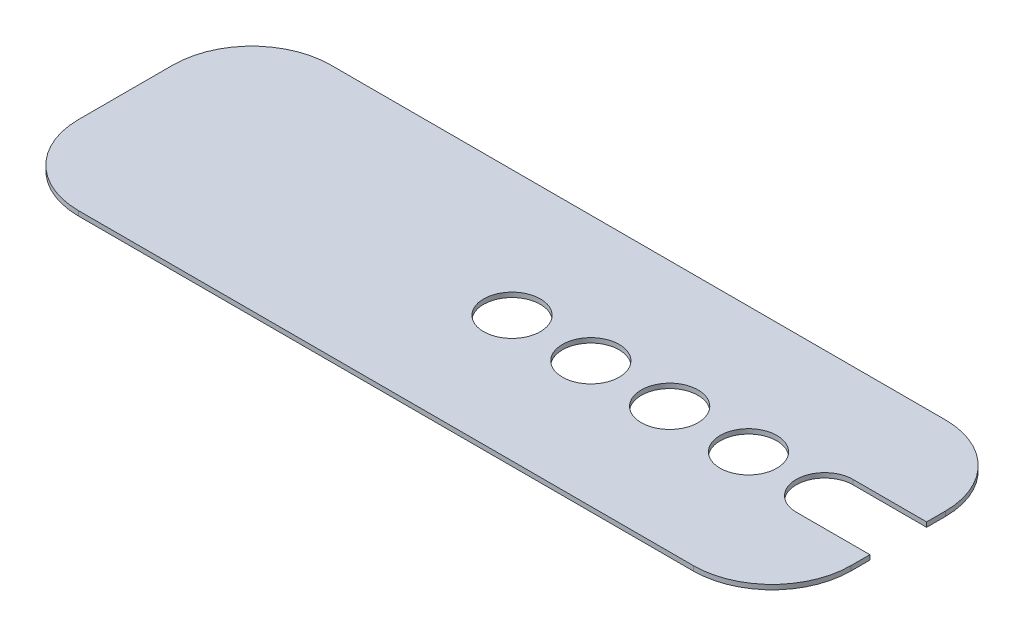
ISO-10303-21;
HEADER;
FILE_DESCRIPTION(('STEP AP214'),'2;1');
FILE_NAME('part.step','',(''),(''),'','','');
FILE_SCHEMA(('AUTOMOTIVE_DESIGN { 1 0 10303 214 1 1 1 1 }'));
ENDSEC;
DATA;
#1=APPLICATION_CONTEXT('core data for automotive mechanical design processes');
#2=APPLICATION_PROTOCOL_DEFINITION('international standard','automotive_design',2000,#1);
#3=PRODUCT_CONTEXT('',#1,'mechanical');
#4=PRODUCT('Part','Part','',(#3));
#5=PRODUCT_RELATED_PRODUCT_CATEGORY('part','',(#4));
#6=PRODUCT_DEFINITION_FORMATION('','',#4);
#7=PRODUCT_DEFINITION_CONTEXT('part definition',#1,'design');
#8=PRODUCT_DEFINITION('design','',#6,#7);
#9=PRODUCT_DEFINITION_SHAPE('','',#8);
#10=(LENGTH_UNIT() NAMED_UNIT(*) SI_UNIT(.MILLI.,.METRE.));
#11=(NAMED_UNIT(*) PLANE_ANGLE_UNIT() SI_UNIT($,.RADIAN.));
#12=(NAMED_UNIT(*) SI_UNIT($,.STERADIAN.) SOLID_ANGLE_UNIT());
#13=UNCERTAINTY_MEASURE_WITH_UNIT(LENGTH_MEASURE(1.E-05),#10,'distance_accuracy_value','');
#14=(GEOMETRIC_REPRESENTATION_CONTEXT(3) GLOBAL_UNCERTAINTY_ASSIGNED_CONTEXT((#13)) GLOBAL_UNIT_ASSIGNED_CONTEXT((#10,
#11,#12)) REPRESENTATION_CONTEXT('',''));
#15=CARTESIAN_POINT('',(0.,0.,0.));
#16=DIRECTION('',(0.,0.,1.));
#17=DIRECTION('',(1.,0.,0.));
#18=AXIS2_PLACEMENT_3D('',#15,#16,#17);
#19=CARTESIAN_POINT('',(122.5,1.5,-14.9999999999998));
#20=DIRECTION('',(-1.,0.,0.));
#21=DIRECTION('',(0.,0.,1.));
#22=AXIS2_PLACEMENT_3D('',#19,#20,#21);
#23=PLANE('',#22);
#24=DIRECTION('',(0.,0.,-1.));
#25=VECTOR('',#24,1.);
#26=CARTESIAN_POINT('',(122.5,1.5,-14.9999999999998));
#27=LINE('',#26,#25);
#28=CARTESIAN_POINT('',(122.5,1.5,-9.));
#29=VERTEX_POINT('',#28);
#30=CARTESIAN_POINT('',(122.5,1.5,-14.9999999999998));
#31=VERTEX_POINT('',#30);
#32=EDGE_CURVE('E60',#29,#31,#27,.T.);
#33=ORIENTED_EDGE('',*,*,#32,.F.);
#34=DIRECTION('',(0.,1.,0.));
#35=VECTOR('',#34,1.);
#36=CARTESIAN_POINT('',(122.5,0.,-9.));
#37=LINE('',#36,#35);
#38=CARTESIAN_POINT('',(122.5,0.,-9.));
#39=VERTEX_POINT('',#38);
#40=EDGE_CURVE('E225',#39,#29,#37,.T.);
#41=ORIENTED_EDGE('',*,*,#40,.F.);
#42=DIRECTION('',(0.,0.,-1.));
#43=VECTOR('',#42,1.);
#44=CARTESIAN_POINT('',(122.5,0.,-14.9999999999998));
#45=LINE('',#44,#43);
#46=CARTESIAN_POINT('',(122.5,0.,-14.9999999999998));
#47=VERTEX_POINT('',#46);
#48=EDGE_CURVE('E94',#39,#47,#45,.T.);
#49=ORIENTED_EDGE('',*,*,#48,.T.);
#50=DIRECTION('',(0.,-1.,0.));
#51=VECTOR('',#50,1.);
#52=CARTESIAN_POINT('',(122.5,1.5,-14.9999999999998));
#53=LINE('',#52,#51);
#54=EDGE_CURVE('E150',#31,#47,#53,.T.);
#55=ORIENTED_EDGE('',*,*,#54,.F.);
#56=EDGE_LOOP('',(#33,#41,#49,#55));
#57=FACE_BOUND('',#56,.T.);
#58=ADVANCED_FACE('F36',(#57),#23,.F.);
#59=CARTESIAN_POINT('',(97.5,1.5,-15.));
#60=DIRECTION('',(0.,-1.,0.));
#61=DIRECTION('',(0.,0.,-1.));
#62=AXIS2_PLACEMENT_3D('',#59,#60,#61);
#63=CYLINDRICAL_SURFACE('',#62,25.);
#64=CARTESIAN_POINT('',(97.5,0.,-15.));
#65=DIRECTION('',(0.,1.,0.));
#66=DIRECTION('',(0.,0.,1.));
#67=AXIS2_PLACEMENT_3D('',#64,#65,#66);
#68=CIRCLE('',#67,25.);
#69=CARTESIAN_POINT('',(97.4999999999998,0.,-40.));
#70=VERTEX_POINT('',#69);
#71=EDGE_CURVE('E151',#47,#70,#68,.T.);
#72=ORIENTED_EDGE('',*,*,#71,.T.);
#73=DIRECTION('',(0.,-1.,0.));
#74=VECTOR('',#73,1.);
#75=CARTESIAN_POINT('',(97.4999999999998,1.5,-40.));
#76=LINE('',#75,#74);
#77=CARTESIAN_POINT('',(97.4999999999998,1.5,-40.));
#78=VERTEX_POINT('',#77);
#79=EDGE_CURVE('E11',#78,#70,#76,.T.);
#80=ORIENTED_EDGE('',*,*,#79,.F.);
#81=CARTESIAN_POINT('',(97.5,1.5,-15.));
#82=DIRECTION('',(0.,1.,0.));
#83=DIRECTION('',(0.,0.,1.));
#84=AXIS2_PLACEMENT_3D('',#81,#82,#83);
#85=CIRCLE('',#84,25.);
#86=EDGE_CURVE('E169',#31,#78,#85,.T.);
#87=ORIENTED_EDGE('',*,*,#86,.F.);
#88=ORIENTED_EDGE('',*,*,#54,.T.);
#89=EDGE_LOOP('',(#72,#80,#87,#88));
#90=FACE_BOUND('',#89,.T.);
#91=ADVANCED_FACE('F38',(#90),#63,.T.);
#92=CARTESIAN_POINT('',(-97.4999999999998,1.5,-40.));
#93=DIRECTION('',(0.,0.,1.));
#94=DIRECTION('',(1.,0.,0.));
#95=AXIS2_PLACEMENT_3D('',#92,#93,#94);
#96=PLANE('',#95);
#97=DIRECTION('',(-1.,0.,0.));
#98=VECTOR('',#97,1.);
#99=CARTESIAN_POINT('',(-97.4999999999998,0.,-40.));
#100=LINE('',#99,#98);
#101=CARTESIAN_POINT('',(-97.4999999999998,0.,-40.));
#102=VERTEX_POINT('',#101);
#103=EDGE_CURVE('E154',#70,#102,#100,.T.);
#104=ORIENTED_EDGE('',*,*,#103,.T.);
#105=DIRECTION('',(0.,-1.,0.));
#106=VECTOR('',#105,1.);
#107=CARTESIAN_POINT('',(-97.4999999999998,1.5,-40.));
#108=LINE('',#107,#106);
#109=CARTESIAN_POINT('',(-97.4999999999998,1.5,-40.));
#110=VERTEX_POINT('',#109);
#111=EDGE_CURVE('E44',#110,#102,#108,.T.);
#112=ORIENTED_EDGE('',*,*,#111,.F.);
#113=DIRECTION('',(-1.,0.,0.));
#114=VECTOR('',#113,1.);
#115=CARTESIAN_POINT('',(-97.4999999999998,1.5,-40.));
#116=LINE('',#115,#114);
#117=EDGE_CURVE('E102',#78,#110,#116,.T.);
#118=ORIENTED_EDGE('',*,*,#117,.F.);
#119=ORIENTED_EDGE('',*,*,#79,.T.);
#120=EDGE_LOOP('',(#104,#112,#118,#119));
#121=FACE_BOUND('',#120,.T.);
#122=ADVANCED_FACE('F282',(#121),#96,.F.);
#123=CARTESIAN_POINT('',(-97.5,1.5,-15.));
#124=DIRECTION('',(0.,-1.,0.));
#125=DIRECTION('',(0.,0.,-1.));
#126=AXIS2_PLACEMENT_3D('',#123,#124,#125);
#127=CYLINDRICAL_SURFACE('',#126,25.);
#128=CARTESIAN_POINT('',(-97.5,0.,-15.));
#129=DIRECTION('',(0.,1.,0.));
#130=DIRECTION('',(0.,0.,1.));
#131=AXIS2_PLACEMENT_3D('',#128,#129,#130);
#132=CIRCLE('',#131,25.);
#133=CARTESIAN_POINT('',(-122.5,0.,-14.9999999999998));
#134=VERTEX_POINT('',#133);
#135=EDGE_CURVE('E157',#102,#134,#132,.T.);
#136=ORIENTED_EDGE('',*,*,#135,.T.);
#137=DIRECTION('',(0.,-1.,0.));
#138=VECTOR('',#137,1.);
#139=CARTESIAN_POINT('',(-122.5,1.5,-14.9999999999998));
#140=LINE('',#139,#138);
#141=CARTESIAN_POINT('',(-122.5,1.5,-14.9999999999998));
#142=VERTEX_POINT('',#141);
#143=EDGE_CURVE('E176',#142,#134,#140,.T.);
#144=ORIENTED_EDGE('',*,*,#143,.F.);
#145=CARTESIAN_POINT('',(-97.5,1.5,-15.));
#146=DIRECTION('',(0.,1.,0.));
#147=DIRECTION('',(0.,0.,1.));
#148=AXIS2_PLACEMENT_3D('',#145,#146,#147);
#149=CIRCLE('',#148,25.);
#150=EDGE_CURVE('E184',#110,#142,#149,.T.);
#151=ORIENTED_EDGE('',*,*,#150,.F.);
#152=ORIENTED_EDGE('',*,*,#111,.T.);
#153=EDGE_LOOP('',(#136,#144,#151,#152));
#154=FACE_BOUND('',#153,.T.);
#155=ADVANCED_FACE('F182',(#154),#127,.T.);
#156=CARTESIAN_POINT('',(-122.5,1.5,-14.9999999999998));
#157=DIRECTION('',(1.,0.,0.));
#158=DIRECTION('',(0.,0.,-1.));
#159=AXIS2_PLACEMENT_3D('',#156,#157,#158);
#160=PLANE('',#159);
#161=DIRECTION('',(0.,0.,1.));
#162=VECTOR('',#161,1.);
#163=CARTESIAN_POINT('',(-122.5,0.,-14.9999999999998));
#164=LINE('',#163,#162);
#165=CARTESIAN_POINT('',(-122.5,0.,14.9999999999998));
#166=VERTEX_POINT('',#165);
#167=EDGE_CURVE('E159',#134,#166,#164,.T.);
#168=ORIENTED_EDGE('',*,*,#167,.T.);
#169=DIRECTION('',(0.,-1.,0.));
#170=VECTOR('',#169,1.);
#171=CARTESIAN_POINT('',(-122.5,1.5,14.9999999999998));
#172=LINE('',#171,#170);
#173=CARTESIAN_POINT('',(-122.5,1.5,14.9999999999998));
#174=VERTEX_POINT('',#173);
#175=EDGE_CURVE('E173',#174,#166,#172,.T.);
#176=ORIENTED_EDGE('',*,*,#175,.F.);
#177=DIRECTION('',(0.,0.,1.));
#178=VECTOR('',#177,1.);
#179=CARTESIAN_POINT('',(-122.5,1.5,-14.9999999999998));
#180=LINE('',#179,#178);
#181=EDGE_CURVE('E196',#142,#174,#180,.T.);
#182=ORIENTED_EDGE('',*,*,#181,.F.);
#183=ORIENTED_EDGE('',*,*,#143,.T.);
#184=EDGE_LOOP('',(#168,#176,#182,#183));
#185=FACE_BOUND('',#184,.T.);
#186=ADVANCED_FACE('F192',(#185),#160,.F.);
#187=CARTESIAN_POINT('',(-97.5,1.5,15.));
#188=DIRECTION('',(0.,-1.,0.));
#189=DIRECTION('',(0.,0.,-1.));
#190=AXIS2_PLACEMENT_3D('',#187,#188,#189);
#191=CYLINDRICAL_SURFACE('',#190,25.);
#192=CARTESIAN_POINT('',(-97.5,0.,15.));
#193=DIRECTION('',(0.,1.,0.));
#194=DIRECTION('',(0.,0.,-1.));
#195=AXIS2_PLACEMENT_3D('',#192,#193,#194);
#196=CIRCLE('',#195,25.);
#197=CARTESIAN_POINT('',(-97.4999999999998,0.,40.));
#198=VERTEX_POINT('',#197);
#199=EDGE_CURVE('E161',#166,#198,#196,.T.);
#200=ORIENTED_EDGE('',*,*,#199,.T.);
#201=DIRECTION('',(0.,-1.,0.));
#202=VECTOR('',#201,1.);
#203=CARTESIAN_POINT('',(-97.4999999999998,1.5,40.));
#204=LINE('',#203,#202);
#205=CARTESIAN_POINT('',(-97.4999999999998,1.5,40.));
#206=VERTEX_POINT('',#205);
#207=EDGE_CURVE('E139',#206,#198,#204,.T.);
#208=ORIENTED_EDGE('',*,*,#207,.F.);
#209=CARTESIAN_POINT('',(-97.5,1.5,15.));
#210=DIRECTION('',(0.,1.,0.));
#211=DIRECTION('',(0.,0.,-1.));
#212=AXIS2_PLACEMENT_3D('',#209,#210,#211);
#213=CIRCLE('',#212,25.);
#214=EDGE_CURVE('E127',#174,#206,#213,.T.);
#215=ORIENTED_EDGE('',*,*,#214,.F.);
#216=ORIENTED_EDGE('',*,*,#175,.T.);
#217=EDGE_LOOP('',(#200,#208,#215,#216));
#218=FACE_BOUND('',#217,.T.);
#219=ADVANCED_FACE('F195',(#218),#191,.T.);
#220=CARTESIAN_POINT('',(-97.4999999999998,1.5,40.));
#221=DIRECTION('',(0.,0.,-1.));
#222=DIRECTION('',(-1.,0.,0.));
#223=AXIS2_PLACEMENT_3D('',#220,#221,#222);
#224=PLANE('',#223);
#225=DIRECTION('',(1.,0.,0.));
#226=VECTOR('',#225,1.);
#227=CARTESIAN_POINT('',(-97.4999999999998,0.,40.));
#228=LINE('',#227,#226);
#229=CARTESIAN_POINT('',(97.4999999999998,0.,40.));
#230=VERTEX_POINT('',#229);
#231=EDGE_CURVE('E136',#198,#230,#228,.T.);
#232=ORIENTED_EDGE('',*,*,#231,.T.);
#233=DIRECTION('',(0.,-1.,0.));
#234=VECTOR('',#233,1.);
#235=CARTESIAN_POINT('',(97.4999999999998,1.5,40.));
#236=LINE('',#235,#234);
#237=CARTESIAN_POINT('',(97.4999999999998,1.5,40.));
#238=VERTEX_POINT('',#237);
#239=EDGE_CURVE('E133',#238,#230,#236,.T.);
#240=ORIENTED_EDGE('',*,*,#239,.F.);
#241=DIRECTION('',(1.,0.,0.));
#242=VECTOR('',#241,1.);
#243=CARTESIAN_POINT('',(-97.4999999999998,1.5,40.));
#244=LINE('',#243,#242);
#245=EDGE_CURVE('E118',#206,#238,#244,.T.);
#246=ORIENTED_EDGE('',*,*,#245,.F.);
#247=ORIENTED_EDGE('',*,*,#207,.T.);
#248=EDGE_LOOP('',(#232,#240,#246,#247));
#249=FACE_BOUND('',#248,.T.);
#250=ADVANCED_FACE('F134',(#249),#224,.F.);
#251=CARTESIAN_POINT('',(97.5,1.5,15.));
#252=DIRECTION('',(0.,-1.,0.));
#253=DIRECTION('',(0.,0.,-1.));
#254=AXIS2_PLACEMENT_3D('',#251,#252,#253);
#255=CYLINDRICAL_SURFACE('',#254,25.);
#256=CARTESIAN_POINT('',(97.5,0.,15.));
#257=DIRECTION('',(0.,1.,0.));
#258=DIRECTION('',(0.,0.,1.));
#259=AXIS2_PLACEMENT_3D('',#256,#257,#258);
#260=CIRCLE('',#259,25.);
#261=CARTESIAN_POINT('',(122.5,0.,14.9999999999998));
#262=VERTEX_POINT('',#261);
#263=EDGE_CURVE('E164',#230,#262,#260,.T.);
#264=ORIENTED_EDGE('',*,*,#263,.T.);
#265=DIRECTION('',(0.,-1.,0.));
#266=VECTOR('',#265,1.);
#267=CARTESIAN_POINT('',(122.5,1.5,14.9999999999998));
#268=LINE('',#267,#266);
#269=CARTESIAN_POINT('',(122.5,1.5,14.9999999999998));
#270=VERTEX_POINT('',#269);
#271=EDGE_CURVE('E140',#270,#262,#268,.T.);
#272=ORIENTED_EDGE('',*,*,#271,.F.);
#273=CARTESIAN_POINT('',(97.5,1.5,15.));
#274=DIRECTION('',(0.,1.,0.));
#275=DIRECTION('',(0.,0.,1.));
#276=AXIS2_PLACEMENT_3D('',#273,#274,#275);
#277=CIRCLE('',#276,25.);
#278=EDGE_CURVE('E124',#238,#270,#277,.T.);
#279=ORIENTED_EDGE('',*,*,#278,.F.);
#280=ORIENTED_EDGE('',*,*,#239,.T.);
#281=EDGE_LOOP('',(#264,#272,#279,#280));
#282=FACE_BOUND('',#281,.T.);
#283=ADVANCED_FACE('F142',(#282),#255,.T.);
#284=CARTESIAN_POINT('',(122.5,0.,9.));
#285=VERTEX_POINT('',#284);
#286=EDGE_CURVE('E166',#262,#285,#45,.T.);
#287=ORIENTED_EDGE('',*,*,#286,.T.);
#288=DIRECTION('',(0.,1.,0.));
#289=VECTOR('',#288,1.);
#290=CARTESIAN_POINT('',(122.5,0.,9.));
#291=LINE('',#290,#289);
#292=CARTESIAN_POINT('',(122.5,1.5,9.));
#293=VERTEX_POINT('',#292);
#294=EDGE_CURVE('E51',#285,#293,#291,.T.);
#295=ORIENTED_EDGE('',*,*,#294,.T.);
#296=EDGE_CURVE('E146',#270,#293,#27,.T.);
#297=ORIENTED_EDGE('',*,*,#296,.F.);
#298=ORIENTED_EDGE('',*,*,#271,.T.);
#299=EDGE_LOOP('',(#287,#295,#297,#298));
#300=FACE_BOUND('',#299,.T.);
#301=ADVANCED_FACE('F263',(#300),#23,.F.);
#302=CARTESIAN_POINT('',(97.5,1.5,-15.));
#303=DIRECTION('',(0.,1.,0.));
#304=DIRECTION('',(0.,0.,1.));
#305=AXIS2_PLACEMENT_3D('',#302,#303,#304);
#306=PLANE('',#305);
#307=CARTESIAN_POINT('',(50.,1.5,0.));
#308=DIRECTION('',(0.,1.,0.));
#309=DIRECTION('',(0.,0.,1.));
#310=AXIS2_PLACEMENT_3D('',#307,#308,#309);
#311=CIRCLE('',#310,9.);
#312=CARTESIAN_POINT('',(50.,1.5,9.));
#313=VERTEX_POINT('',#312);
#314=EDGE_CURVE('E215',#313,#313,#311,.T.);
#315=ORIENTED_EDGE('',*,*,#314,.F.);
#316=EDGE_LOOP('',(#315));
#317=FACE_BOUND('',#316,.T.);
#318=CARTESIAN_POINT('',(25.,1.5,0.));
#319=DIRECTION('',(0.,1.,0.));
#320=DIRECTION('',(0.,0.,1.));
#321=AXIS2_PLACEMENT_3D('',#318,#319,#320);
#322=CIRCLE('',#321,9.);
#323=CARTESIAN_POINT('',(25.,1.5,9.));
#324=VERTEX_POINT('',#323);
#325=EDGE_CURVE('E208',#324,#324,#322,.T.);
#326=ORIENTED_EDGE('',*,*,#325,.F.);
#327=EDGE_LOOP('',(#326));
#328=FACE_BOUND('',#327,.T.);
#329=CARTESIAN_POINT('',(0.,1.5,0.));
#330=DIRECTION('',(0.,1.,0.));
#331=DIRECTION('',(0.,0.,1.));
#332=AXIS2_PLACEMENT_3D('',#329,#330,#331);
#333=CIRCLE('',#332,9.);
#334=CARTESIAN_POINT('',(0.,1.5,9.));
#335=VERTEX_POINT('',#334);
#336=EDGE_CURVE('E231',#335,#335,#333,.T.);
#337=ORIENTED_EDGE('',*,*,#336,.F.);
#338=EDGE_LOOP('',(#337));
#339=FACE_BOUND('',#338,.T.);
#340=DIRECTION('',(-1.,0.,0.));
#341=VECTOR('',#340,1.);
#342=CARTESIAN_POINT('',(99.15,1.5,-9.));
#343=LINE('',#342,#341);
#344=CARTESIAN_POINT('',(99.15,1.5,-9.));
#345=VERTEX_POINT('',#344);
#346=EDGE_CURVE('E232',#29,#345,#343,.T.);
#347=ORIENTED_EDGE('',*,*,#346,.F.);
#348=ORIENTED_EDGE('',*,*,#32,.T.);
#349=ORIENTED_EDGE('',*,*,#86,.T.);
#350=ORIENTED_EDGE('',*,*,#117,.T.);
#351=ORIENTED_EDGE('',*,*,#150,.T.);
#352=ORIENTED_EDGE('',*,*,#181,.T.);
#353=ORIENTED_EDGE('',*,*,#214,.T.);
#354=ORIENTED_EDGE('',*,*,#245,.T.);
#355=ORIENTED_EDGE('',*,*,#278,.T.);
#356=ORIENTED_EDGE('',*,*,#296,.T.);
#357=DIRECTION('',(1.,0.,0.));
#358=VECTOR('',#357,1.);
#359=CARTESIAN_POINT('',(99.15,1.5,9.));
#360=LINE('',#359,#358);
#361=CARTESIAN_POINT('',(99.15,1.5,9.));
#362=VERTEX_POINT('',#361);
#363=EDGE_CURVE('E236',#362,#293,#360,.T.);
#364=ORIENTED_EDGE('',*,*,#363,.F.);
#365=CARTESIAN_POINT('',(99.15,1.5,0.));
#366=DIRECTION('',(0.,1.,0.));
#367=DIRECTION('',(0.,0.,1.));
#368=AXIS2_PLACEMENT_3D('',#365,#366,#367);
#369=CIRCLE('',#368,9.);
#370=EDGE_CURVE('E238',#345,#362,#369,.T.);
#371=ORIENTED_EDGE('',*,*,#370,.F.);
#372=EDGE_LOOP('',(#347,#348,#349,#350,#351,#352,#353,#354,#355,#356,#364,#371));
#373=FACE_BOUND('',#372,.T.);
#374=CARTESIAN_POINT('',(75.,1.5,0.));
#375=DIRECTION('',(0.,1.,0.));
#376=DIRECTION('',(0.,0.,1.));
#377=AXIS2_PLACEMENT_3D('',#374,#375,#376);
#378=CIRCLE('',#377,9.);
#379=CARTESIAN_POINT('',(75.,1.5,9.));
#380=VERTEX_POINT('',#379);
#381=EDGE_CURVE('E202',#380,#380,#378,.T.);
#382=ORIENTED_EDGE('',*,*,#381,.F.);
#383=EDGE_LOOP('',(#382));
#384=FACE_BOUND('',#383,.T.);
#385=ADVANCED_FACE('F120',(#317,#328,#339,#373,#384),#306,.T.);
#386=CARTESIAN_POINT('',(97.5,0.,-15.));
#387=DIRECTION('',(0.,1.,0.));
#388=DIRECTION('',(0.,0.,1.));
#389=AXIS2_PLACEMENT_3D('',#386,#387,#388);
#390=PLANE('',#389);
#391=CARTESIAN_POINT('',(50.,0.,0.));
#392=DIRECTION('',(0.,1.,0.));
#393=DIRECTION('',(0.,0.,1.));
#394=AXIS2_PLACEMENT_3D('',#391,#392,#393);
#395=CIRCLE('',#394,9.);
#396=CARTESIAN_POINT('',(50.,0.,9.));
#397=VERTEX_POINT('',#396);
#398=EDGE_CURVE('E205',#397,#397,#395,.T.);
#399=ORIENTED_EDGE('',*,*,#398,.T.);
#400=EDGE_LOOP('',(#399));
#401=FACE_BOUND('',#400,.T.);
#402=CARTESIAN_POINT('',(25.,0.,0.));
#403=DIRECTION('',(0.,1.,0.));
#404=DIRECTION('',(0.,0.,1.));
#405=AXIS2_PLACEMENT_3D('',#402,#403,#404);
#406=CIRCLE('',#405,9.);
#407=CARTESIAN_POINT('',(25.,0.,9.));
#408=VERTEX_POINT('',#407);
#409=EDGE_CURVE('E211',#408,#408,#406,.T.);
#410=ORIENTED_EDGE('',*,*,#409,.T.);
#411=EDGE_LOOP('',(#410));
#412=FACE_BOUND('',#411,.T.);
#413=CARTESIAN_POINT('',(0.,0.,0.));
#414=DIRECTION('',(0.,1.,0.));
#415=DIRECTION('',(0.,0.,1.));
#416=AXIS2_PLACEMENT_3D('',#413,#414,#415);
#417=CIRCLE('',#416,9.);
#418=CARTESIAN_POINT('',(0.,0.,9.));
#419=VERTEX_POINT('',#418);
#420=EDGE_CURVE('E212',#419,#419,#417,.T.);
#421=ORIENTED_EDGE('',*,*,#420,.T.);
#422=EDGE_LOOP('',(#421));
#423=FACE_BOUND('',#422,.T.);
#424=CARTESIAN_POINT('',(75.,0.,0.));
#425=DIRECTION('',(0.,1.,0.));
#426=DIRECTION('',(0.,0.,1.));
#427=AXIS2_PLACEMENT_3D('',#424,#425,#426);
#428=CIRCLE('',#427,9.);
#429=CARTESIAN_POINT('',(75.,0.,9.));
#430=VERTEX_POINT('',#429);
#431=EDGE_CURVE('E155',#430,#430,#428,.T.);
#432=ORIENTED_EDGE('',*,*,#431,.T.);
#433=EDGE_LOOP('',(#432));
#434=FACE_BOUND('',#433,.T.);
#435=ORIENTED_EDGE('',*,*,#48,.F.);
#436=DIRECTION('',(-1.,0.,0.));
#437=VECTOR('',#436,1.);
#438=CARTESIAN_POINT('',(99.15,0.,-9.));
#439=LINE('',#438,#437);
#440=CARTESIAN_POINT('',(99.15,0.,-9.));
#441=VERTEX_POINT('',#440);
#442=EDGE_CURVE('E223',#39,#441,#439,.T.);
#443=ORIENTED_EDGE('',*,*,#442,.T.);
#444=CARTESIAN_POINT('',(99.15,0.,0.));
#445=DIRECTION('',(0.,1.,0.));
#446=DIRECTION('',(0.,0.,1.));
#447=AXIS2_PLACEMENT_3D('',#444,#445,#446);
#448=CIRCLE('',#447,9.);
#449=CARTESIAN_POINT('',(99.15,0.,9.));
#450=VERTEX_POINT('',#449);
#451=EDGE_CURVE('E235',#441,#450,#448,.T.);
#452=ORIENTED_EDGE('',*,*,#451,.T.);
#453=DIRECTION('',(1.,0.,0.));
#454=VECTOR('',#453,1.);
#455=CARTESIAN_POINT('',(99.15,0.,9.));
#456=LINE('',#455,#454);
#457=EDGE_CURVE('E243',#450,#285,#456,.T.);
#458=ORIENTED_EDGE('',*,*,#457,.T.);
#459=ORIENTED_EDGE('',*,*,#286,.F.);
#460=ORIENTED_EDGE('',*,*,#263,.F.);
#461=ORIENTED_EDGE('',*,*,#231,.F.);
#462=ORIENTED_EDGE('',*,*,#199,.F.);
#463=ORIENTED_EDGE('',*,*,#167,.F.);
#464=ORIENTED_EDGE('',*,*,#135,.F.);
#465=ORIENTED_EDGE('',*,*,#103,.F.);
#466=ORIENTED_EDGE('',*,*,#71,.F.);
#467=EDGE_LOOP('',(#435,#443,#452,#458,#459,#460,#461,#462,#463,#464,#465,#466));
#468=FACE_BOUND('',#467,.T.);
#469=ADVANCED_FACE('F187',(#401,#412,#423,#434,#468),#390,.F.);
#470=CARTESIAN_POINT('',(75.,0.,0.));
#471=DIRECTION('',(0.,1.,0.));
#472=DIRECTION('',(0.,0.,1.));
#473=AXIS2_PLACEMENT_3D('',#470,#471,#472);
#474=CYLINDRICAL_SURFACE('',#473,9.);
#475=ORIENTED_EDGE('',*,*,#431,.F.);
#476=EDGE_LOOP('',(#475));
#477=FACE_BOUND('',#476,.T.);
#478=ORIENTED_EDGE('',*,*,#381,.T.);
#479=EDGE_LOOP('',(#478));
#480=FACE_BOUND('',#479,.T.);
#481=ADVANCED_FACE('F270',(#477,#480),#474,.F.);
#482=CARTESIAN_POINT('',(99.15,0.,0.));
#483=DIRECTION('',(0.,1.,0.));
#484=DIRECTION('',(0.,0.,1.));
#485=AXIS2_PLACEMENT_3D('',#482,#483,#484);
#486=CYLINDRICAL_SURFACE('',#485,9.);
#487=ORIENTED_EDGE('',*,*,#370,.T.);
#488=DIRECTION('',(0.,1.,0.));
#489=VECTOR('',#488,1.);
#490=CARTESIAN_POINT('',(99.15,0.,9.));
#491=LINE('',#490,#489);
#492=EDGE_CURVE('E220',#450,#362,#491,.T.);
#493=ORIENTED_EDGE('',*,*,#492,.F.);
#494=ORIENTED_EDGE('',*,*,#451,.F.);
#495=DIRECTION('',(0.,1.,0.));
#496=VECTOR('',#495,1.);
#497=CARTESIAN_POINT('',(99.15,0.,-9.));
#498=LINE('',#497,#496);
#499=EDGE_CURVE('E228',#441,#345,#498,.T.);
#500=ORIENTED_EDGE('',*,*,#499,.T.);
#501=EDGE_LOOP('',(#487,#493,#494,#500));
#502=FACE_BOUND('',#501,.T.);
#503=ADVANCED_FACE('F315',(#502),#486,.F.);
#504=CARTESIAN_POINT('',(99.15,0.,-9.));
#505=DIRECTION('',(0.,0.,-1.));
#506=DIRECTION('',(-1.,0.,0.));
#507=AXIS2_PLACEMENT_3D('',#504,#505,#506);
#508=PLANE('',#507);
#509=ORIENTED_EDGE('',*,*,#346,.T.);
#510=ORIENTED_EDGE('',*,*,#499,.F.);
#511=ORIENTED_EDGE('',*,*,#442,.F.);
#512=ORIENTED_EDGE('',*,*,#40,.T.);
#513=EDGE_LOOP('',(#509,#510,#511,#512));
#514=FACE_BOUND('',#513,.T.);
#515=ADVANCED_FACE('F318',(#514),#508,.F.);
#516=CARTESIAN_POINT('',(99.15,0.,9.));
#517=DIRECTION('',(0.,0.,1.));
#518=DIRECTION('',(1.,0.,0.));
#519=AXIS2_PLACEMENT_3D('',#516,#517,#518);
#520=PLANE('',#519);
#521=ORIENTED_EDGE('',*,*,#363,.T.);
#522=ORIENTED_EDGE('',*,*,#294,.F.);
#523=ORIENTED_EDGE('',*,*,#457,.F.);
#524=ORIENTED_EDGE('',*,*,#492,.T.);
#525=EDGE_LOOP('',(#521,#522,#523,#524));
#526=FACE_BOUND('',#525,.T.);
#527=ADVANCED_FACE('F258',(#526),#520,.F.);
#528=CARTESIAN_POINT('',(0.,0.,0.));
#529=DIRECTION('',(0.,1.,0.));
#530=DIRECTION('',(0.,0.,1.));
#531=AXIS2_PLACEMENT_3D('',#528,#529,#530);
#532=CYLINDRICAL_SURFACE('',#531,9.);
#533=ORIENTED_EDGE('',*,*,#420,.F.);
#534=EDGE_LOOP('',(#533));
#535=FACE_BOUND('',#534,.T.);
#536=ORIENTED_EDGE('',*,*,#336,.T.);
#537=EDGE_LOOP('',(#536));
#538=FACE_BOUND('',#537,.T.);
#539=ADVANCED_FACE('F254',(#535,#538),#532,.F.);
#540=CARTESIAN_POINT('',(25.,0.,0.));
#541=DIRECTION('',(0.,1.,0.));
#542=DIRECTION('',(0.,0.,1.));
#543=AXIS2_PLACEMENT_3D('',#540,#541,#542);
#544=CYLINDRICAL_SURFACE('',#543,9.);
#545=ORIENTED_EDGE('',*,*,#409,.F.);
#546=EDGE_LOOP('',(#545));
#547=FACE_BOUND('',#546,.T.);
#548=ORIENTED_EDGE('',*,*,#325,.T.);
#549=EDGE_LOOP('',(#548));
#550=FACE_BOUND('',#549,.T.);
#551=ADVANCED_FACE('F257',(#547,#550),#544,.F.);
#552=CARTESIAN_POINT('',(50.,0.,0.));
#553=DIRECTION('',(0.,1.,0.));
#554=DIRECTION('',(0.,0.,1.));
#555=AXIS2_PLACEMENT_3D('',#552,#553,#554);
#556=CYLINDRICAL_SURFACE('',#555,9.);
#557=ORIENTED_EDGE('',*,*,#398,.F.);
#558=EDGE_LOOP('',(#557));
#559=FACE_BOUND('',#558,.T.);
#560=ORIENTED_EDGE('',*,*,#314,.T.);
#561=EDGE_LOOP('',(#560));
#562=FACE_BOUND('',#561,.T.);
#563=ADVANCED_FACE('F329',(#559,#562),#556,.F.);
#564=CLOSED_SHELL('',(#58,#91,#122,#155,#186,#219,#250,#283,#301,#385,#469,#481,#503,#515,#527,
#539,#551,#563));
#565=MANIFOLD_SOLID_BREP('B2',#564);
#566=ADVANCED_BREP_SHAPE_REPRESENTATION('',(#18,#565),#14);
#567=SHAPE_DEFINITION_REPRESENTATION(#9,#566);
ENDSEC;
END-ISO-10303-21;
